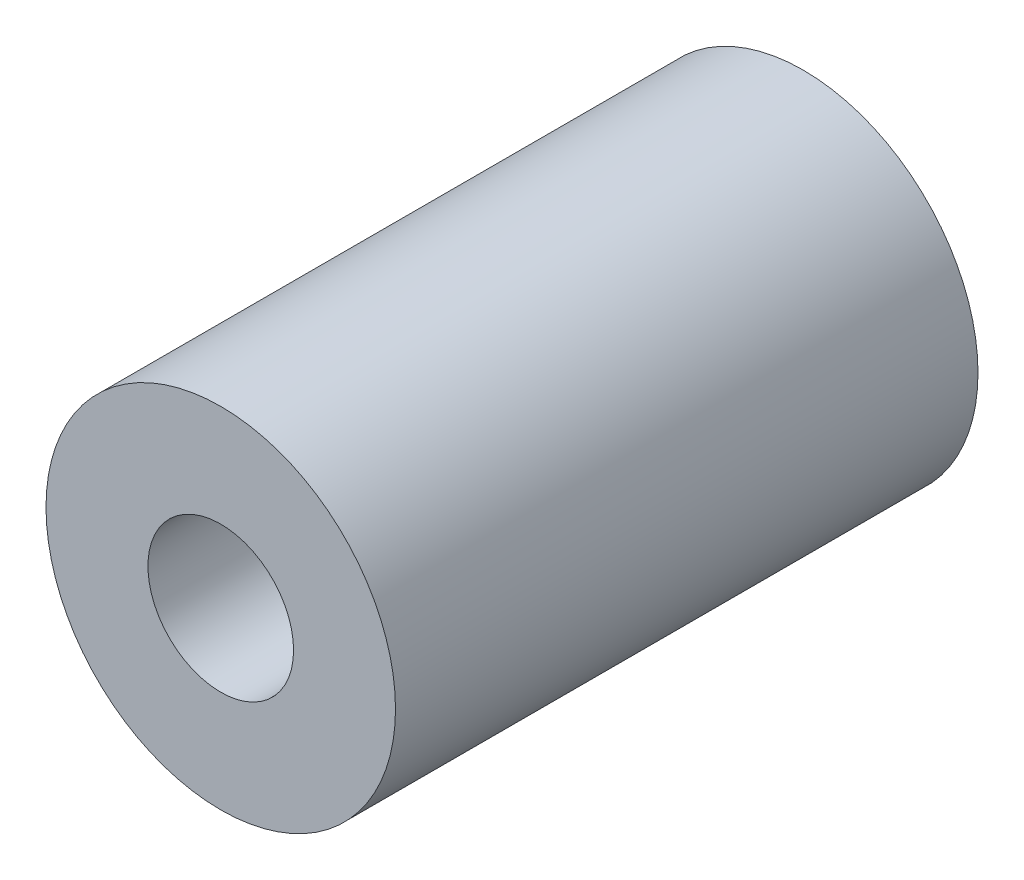
ISO-10303-21;
HEADER;
FILE_DESCRIPTION(('STEP AP214'),'2;1');
FILE_NAME('part.step','',(''),(''),'','','');
FILE_SCHEMA(('AUTOMOTIVE_DESIGN { 1 0 10303 214 1 1 1 1 }'));
ENDSEC;
DATA;
#1=APPLICATION_CONTEXT('core data for automotive mechanical design processes');
#2=APPLICATION_PROTOCOL_DEFINITION('international standard','automotive_design',2000,#1);
#3=PRODUCT_CONTEXT('',#1,'mechanical');
#4=PRODUCT('Part','Part','',(#3));
#5=PRODUCT_RELATED_PRODUCT_CATEGORY('part','',(#4));
#6=PRODUCT_DEFINITION_FORMATION('','',#4);
#7=PRODUCT_DEFINITION_CONTEXT('part definition',#1,'design');
#8=PRODUCT_DEFINITION('design','',#6,#7);
#9=PRODUCT_DEFINITION_SHAPE('','',#8);
#10=(LENGTH_UNIT() NAMED_UNIT(*) SI_UNIT(.MILLI.,.METRE.));
#11=(NAMED_UNIT(*) PLANE_ANGLE_UNIT() SI_UNIT($,.RADIAN.));
#12=(NAMED_UNIT(*) SI_UNIT($,.STERADIAN.) SOLID_ANGLE_UNIT());
#13=UNCERTAINTY_MEASURE_WITH_UNIT(LENGTH_MEASURE(1.E-05),#10,'distance_accuracy_value','');
#14=(GEOMETRIC_REPRESENTATION_CONTEXT(3) GLOBAL_UNCERTAINTY_ASSIGNED_CONTEXT((#13)) GLOBAL_UNIT_ASSIGNED_CONTEXT((#10,
#11,#12)) REPRESENTATION_CONTEXT('',''));
#15=CARTESIAN_POINT('',(0.,0.,0.));
#16=DIRECTION('',(0.,0.,1.));
#17=DIRECTION('',(1.,0.,0.));
#18=AXIS2_PLACEMENT_3D('',#15,#16,#17);
#19=CARTESIAN_POINT('',(0.,0.,20.));
#20=DIRECTION('',(0.,0.,1.));
#21=DIRECTION('',(1.,0.,0.));
#22=AXIS2_PLACEMENT_3D('',#19,#20,#21);
#23=PLANE('',#22);
#24=CARTESIAN_POINT('',(0.,0.,20.));
#25=DIRECTION('',(0.,0.,1.));
#26=DIRECTION('',(1.,0.,0.));
#27=AXIS2_PLACEMENT_3D('',#24,#25,#26);
#28=CIRCLE('',#27,6.);
#29=CARTESIAN_POINT('',(6.,0.,20.));
#30=VERTEX_POINT('',#29);
#31=EDGE_CURVE('E10',#30,#30,#28,.T.);
#32=ORIENTED_EDGE('',*,*,#31,.T.);
#33=EDGE_LOOP('',(#32));
#34=FACE_BOUND('',#33,.T.);
#35=CARTESIAN_POINT('',(0.,0.,20.));
#36=DIRECTION('',(0.,0.,1.));
#37=DIRECTION('',(1.,0.,0.));
#38=AXIS2_PLACEMENT_3D('',#35,#36,#37);
#39=CIRCLE('',#38,2.5);
#40=CARTESIAN_POINT('',(2.5,0.,20.));
#41=VERTEX_POINT('',#40);
#42=EDGE_CURVE('E49',#41,#41,#39,.T.);
#43=ORIENTED_EDGE('',*,*,#42,.F.);
#44=EDGE_LOOP('',(#43));
#45=FACE_BOUND('',#44,.T.);
#46=ADVANCED_FACE('F31',(#34,#45),#23,.T.);
#47=CARTESIAN_POINT('',(0.,0.,0.));
#48=DIRECTION('',(0.,0.,1.));
#49=DIRECTION('',(1.,0.,0.));
#50=AXIS2_PLACEMENT_3D('',#47,#48,#49);
#51=PLANE('',#50);
#52=CARTESIAN_POINT('',(0.,0.,0.));
#53=DIRECTION('',(0.,0.,1.));
#54=DIRECTION('',(1.,0.,0.));
#55=AXIS2_PLACEMENT_3D('',#52,#53,#54);
#56=CIRCLE('',#55,6.);
#57=CARTESIAN_POINT('',(6.,0.,0.));
#58=VERTEX_POINT('',#57);
#59=EDGE_CURVE('E44',#58,#58,#56,.T.);
#60=ORIENTED_EDGE('',*,*,#59,.F.);
#61=EDGE_LOOP('',(#60));
#62=FACE_BOUND('',#61,.T.);
#63=CARTESIAN_POINT('',(0.,0.,0.));
#64=DIRECTION('',(0.,0.,1.));
#65=DIRECTION('',(1.,0.,0.));
#66=AXIS2_PLACEMENT_3D('',#63,#64,#65);
#67=CIRCLE('',#66,2.5);
#68=CARTESIAN_POINT('',(2.5,0.,0.));
#69=VERTEX_POINT('',#68);
#70=EDGE_CURVE('E52',#69,#69,#67,.T.);
#71=ORIENTED_EDGE('',*,*,#70,.T.);
#72=EDGE_LOOP('',(#71));
#73=FACE_BOUND('',#72,.T.);
#74=ADVANCED_FACE('F84',(#62,#73),#51,.F.);
#75=CARTESIAN_POINT('',(0.,0.,20.));
#76=DIRECTION('',(0.,0.,-1.));
#77=DIRECTION('',(-1.,0.,0.));
#78=AXIS2_PLACEMENT_3D('',#75,#76,#77);
#79=CYLINDRICAL_SURFACE('',#78,6.);
#80=CARTESIAN_POINT('',(0.,-6.,16.3168562044865));
#81=CARTESIAN_POINT('',(0.0406867125193507,-5.99999944662232,16.3168544699261));
#82=CARTESIAN_POINT('',(0.0813990952861822,-5.99958177263351,16.3134300389247));
#83=CARTESIAN_POINT('',(0.161691669151217,-5.99795576178181,16.2998229758213));
#84=CARTESIAN_POINT('',(0.201270621329137,-5.99674659178938,16.2896332223721));
#85=CARTESIAN_POINT('',(0.278122256727522,-5.99367385407803,16.2627995407322));
#86=CARTESIAN_POINT('',(0.315396447082403,-5.9918107194395,16.2461598831558));
#87=CARTESIAN_POINT('',(0.386615967715561,-5.98763745519959,16.2069079051673));
#88=CARTESIAN_POINT('',(0.420561882601663,-5.98532740431124,16.1842966362484));
#89=CARTESIAN_POINT('',(0.484344661416893,-5.9805049605666,16.1336177731097));
#90=CARTESIAN_POINT('',(0.51416177217963,-5.97799168036421,16.1055254001488));
#91=CARTESIAN_POINT('',(0.568670476201841,-5.97305322473375,16.0447349293714));
#92=CARTESIAN_POINT('',(0.593361812422815,-5.97062805372906,16.0120366007214));
#93=CARTESIAN_POINT('',(0.636991112151046,-5.96613162791311,15.9428347389644));
#94=CARTESIAN_POINT('',(0.655910663780385,-5.96406151473546,15.906319517264));
#95=CARTESIAN_POINT('',(0.687341760107543,-5.96052120030255,15.8306008675067));
#96=CARTESIAN_POINT('',(0.699853533574907,-5.95905097763049,15.7913975354769));
#97=CARTESIAN_POINT('',(0.718054101513752,-5.95688532346395,15.7116200216804));
#98=CARTESIAN_POINT('',(0.723776166692863,-5.95618611507321,15.67105353465));
#99=CARTESIAN_POINT('',(0.728337823358177,-5.95563007572933,15.5895304853771));
#100=CARTESIAN_POINT('',(0.727177675605782,-5.95577321286043,15.5485739379725));
#101=CARTESIAN_POINT('',(0.718035167813165,-5.95688223604946,15.4676648219018));
#102=CARTESIAN_POINT('',(0.710089402908885,-5.95784370869435,15.4277080490092));
#103=CARTESIAN_POINT('',(0.687658283342413,-5.96047418470433,15.349699258168));
#104=CARTESIAN_POINT('',(0.673172803450605,-5.96214320161821,15.31164727671));
#105=CARTESIAN_POINT('',(0.638033933873038,-5.96600572794749,15.2384142196841));
#106=CARTESIAN_POINT('',(0.617364586292891,-5.96820059139065,15.2032408753998));
#107=CARTESIAN_POINT('',(0.570456132124663,-5.97286644393221,15.1368482335737));
#108=CARTESIAN_POINT('',(0.544216785974846,-5.97533744490493,15.1056291061923));
#109=CARTESIAN_POINT('',(0.486710099055614,-5.98029678197863,15.0478186439507));
#110=CARTESIAN_POINT('',(0.455411204893024,-5.98278512642109,15.0212586873149));
#111=CARTESIAN_POINT('',(0.388782677581777,-5.98748373812367,14.9737646383351));
#112=CARTESIAN_POINT('',(0.353453036061235,-5.9896940048062,14.9528305576764));
#113=CARTESIAN_POINT('',(0.279742102669006,-5.99358868047777,14.9171826923652));
#114=CARTESIAN_POINT('',(0.2413598815604,-5.99527292856663,14.9024708104915));
#115=CARTESIAN_POINT('',(0.162644945634727,-5.99792431403471,14.8797095501496));
#116=CARTESIAN_POINT('',(0.12231231671516,-5.99889148296409,14.8716598785546));
#117=CARTESIAN_POINT('',(0.041112841616446,-5.99999564404019,14.8624920647673));
#118=CARTESIAN_POINT('',(0.000250944757522722,-6.00013781452519,14.8613306852233));
#119=CARTESIAN_POINT('',(-0.0810851432364221,-5.99958992540127,14.8658584089032));
#120=CARTESIAN_POINT('',(-0.121559342106561,-5.99889988243118,14.871547375165));
#121=CARTESIAN_POINT('',(-0.20084400315693,-5.99676833953825,14.8895783898624));
#122=CARTESIAN_POINT('',(-0.239659207615562,-5.99532916167678,14.9018998837399));
#123=CARTESIAN_POINT('',(-0.314672264393776,-5.99186052646804,14.9328248628737));
#124=CARTESIAN_POINT('',(-0.350870032671799,-5.98983105017776,14.9514285497323));
#125=CARTESIAN_POINT('',(-0.419814194247367,-5.98539528867354,14.9944948686635));
#126=CARTESIAN_POINT('',(-0.452542954453183,-5.98298721968749,15.0189855424159));
#127=CARTESIAN_POINT('',(-0.513440801600527,-5.97806939685024,15.0730908751585));
#128=CARTESIAN_POINT('',(-0.541609718691035,-5.97555963921556,15.1027057249357));
#129=CARTESIAN_POINT('',(-0.592741130994908,-5.97070539169744,15.1664089177278));
#130=CARTESIAN_POINT('',(-0.615675011470036,-5.96836185623161,15.2005203116497));
#131=CARTESIAN_POINT('',(-0.655487821985608,-5.96412091361288,15.2721361371276));
#132=CARTESIAN_POINT('',(-0.672366867228649,-5.96222349797208,15.30964050411));
#133=CARTESIAN_POINT('',(-0.699544283426195,-5.95909605102472,15.3868843749764));
#134=CARTESIAN_POINT('',(-0.709858935257932,-5.95786436973076,15.4266180809692));
#135=CARTESIAN_POINT('',(-0.723667269174156,-5.95620305598766,15.5072693928005));
#136=CARTESIAN_POINT('',(-0.727161248079337,-5.95577338863667,15.5481869470418));
#137=CARTESIAN_POINT('',(-0.72722383085185,-5.95576572450737,15.629759830196));
#138=CARTESIAN_POINT('',(-0.723837387532693,-5.95618219950958,15.6704151314488));
#139=CARTESIAN_POINT('',(-0.710330291243021,-5.95780802509234,15.7505742696645));
#140=CARTESIAN_POINT('',(-0.700209636245643,-5.95901737591152,15.7900781062806));
#141=CARTESIAN_POINT('',(-0.673535195164139,-5.96209100959633,15.8668079407494));
#142=CARTESIAN_POINT('',(-0.656983437423161,-5.96395508594646,15.9040346525172));
#143=CARTESIAN_POINT('',(-0.617921073182439,-5.96812849116855,15.9751893829766));
#144=CARTESIAN_POINT('',(-0.595410409743558,-5.97043782429502,16.0091173701437));
#145=CARTESIAN_POINT('',(-0.544902046666125,-5.97525962308448,16.0729414928126));
#146=CARTESIAN_POINT('',(-0.516870830718767,-5.97777327151993,16.1028110168939));
#147=CARTESIAN_POINT('',(-0.456186618389702,-5.98270996285759,16.1574398208938));
#148=CARTESIAN_POINT('',(-0.423532531255691,-5.98513298420555,16.1821978913816));
#149=CARTESIAN_POINT('',(-0.35439610025209,-5.98962492787758,16.2259757724368));
#150=CARTESIAN_POINT('',(-0.317900461220229,-5.99169255059318,16.244974708717));
#151=CARTESIAN_POINT('',(-0.242232559024622,-5.99522744634168,16.2765475046649));
#152=CARTESIAN_POINT('',(-0.203063275982467,-5.99669537545826,16.2891283896524));
#153=CARTESIAN_POINT('',(-0.136406711588779,-5.99850912349959,16.3044754909499));
#154=CARTESIAN_POINT('',(-0.109340795991718,-5.9990654980085,16.3091116413199));
#155=CARTESIAN_POINT('',(-0.054853808588104,-5.99981112156948,16.3153025723981));
#156=CARTESIAN_POINT('',(-0.0274327391912447,-6.00000037311114,16.3168573740021));
#157=CARTESIAN_POINT('',(0.,-6.,16.3168562044865));
#158=B_SPLINE_CURVE_WITH_KNOTS('',3,(#80,#81,#82,#83,#84,#85,#86,#87,#88,#89,#90,#91,#92,#93,
#94,#95,#96,#97,#98,#99,#100,#101,#102,#103,#104,#105,#106,#107,#108,#109,#110,#111,#112,#113,
#114,#115,#116,#117,#118,#119,#120,#121,#122,#123,#124,#125,#126,#127,#128,#129,#130,#131,#132,
#133,#134,#135,#136,#137,#138,#139,#140,#141,#142,#143,#144,#145,#146,#147,#148,#149,#150,#151,
#152,#153,#154,#155,#156,#157),.UNSPECIFIED.,.T.,.F.,(4,2,2,2,2,2,2,2,2,2,2,2,2,2,2,2,2,2,2,2,2,
2,2,2,2,2,2,2,2,2,2,2,2,2,2,2,2,2,4),(0.,0.121959939359488,0.244048460764506,0.366056282550026,
0.488042635261983,0.610593800375944,0.733151109490645,0.856095381606163,0.979035264077471,
1.10137019946073,1.22370049970324,1.34537520354862,1.46705223745313,1.58904601611211,
1.7110450427015,1.8338365434332,1.9566282992082,2.07945757820077,2.20228145261273,
2.32433354690492,2.44638320099369,2.5680567761338,2.68973425627851,2.81200323078599,
2.9342767586812,3.05720343129288,3.18012776491056,3.30274602355956,3.42535894601249,
3.54717336076342,3.66898781217808,3.79076387496567,3.9125411014022,4.03508181375553,
4.15765148755217,4.2806602510096,4.40353407627483,4.48576529353596,4.56799595315579),.UNSPECIFIED.);
#159=CARTESIAN_POINT('',(0.,-6.,16.3168562044865));
#160=VERTEX_POINT('',#159);
#161=EDGE_CURVE('E60',#160,#160,#158,.T.);
#162=ORIENTED_EDGE('',*,*,#161,.T.);
#163=EDGE_LOOP('',(#162));
#164=FACE_BOUND('',#163,.T.);
#165=CARTESIAN_POINT('',(0.,-6.,4.99014675090497));
#166=CARTESIAN_POINT('',(0.048450258849126,-5.99999924350012,4.99014473764678));
#167=CARTESIAN_POINT('',(0.0969291357230117,-5.9994069816752,4.98607354135146));
#168=CARTESIAN_POINT('',(0.192533240462012,-5.99710132470148,4.96989964501937));
#169=CARTESIAN_POINT('',(0.23965707983713,-5.99538681954419,4.95778899300582));
#170=CARTESIAN_POINT('',(0.331153576736141,-5.99102945867061,4.92590442775588));
#171=CARTESIAN_POINT('',(0.375528233231743,-5.98838728702018,4.90613616017649));
#172=CARTESIAN_POINT('',(0.460323305897501,-5.98246699343266,4.85951098770333));
#173=CARTESIAN_POINT('',(0.500744299861464,-5.97918896463014,4.83265512072914));
#174=CARTESIAN_POINT('',(0.576785962946577,-5.97233514841792,4.77240870312094));
#175=CARTESIAN_POINT('',(0.612373693628641,-5.96875756270683,4.73897677855763));
#176=CARTESIAN_POINT('',(0.677454550087917,-5.96172202128414,4.66661626065399));
#177=CARTESIAN_POINT('',(0.70694733506232,-5.95826407227111,4.62768736015146));
#178=CARTESIAN_POINT('',(0.759128114916702,-5.95184183879846,4.54521822048252));
#179=CARTESIAN_POINT('',(0.781784464300672,-5.94887987753001,4.50165776164451));
#180=CARTESIAN_POINT('',(0.819447044533628,-5.94380937503717,4.41129993738719));
#181=CARTESIAN_POINT('',(0.834453662465473,-5.9417007906323,4.36450273588591));
#182=CARTESIAN_POINT('',(0.856288983346832,-5.93859336793183,4.26934529293682));
#183=CARTESIAN_POINT('',(0.863173915333762,-5.93758690283622,4.22099820765396));
#184=CARTESIAN_POINT('',(0.868744572849261,-5.93677448445624,4.12382524094512));
#185=CARTESIAN_POINT('',(0.867430736144494,-5.93696846707494,4.0749993852217));
#186=CARTESIAN_POINT('',(0.856687149720778,-5.9385280502203,3.97865082175739));
#187=CARTESIAN_POINT('',(0.847319864107626,-5.93988463313738,3.93112098187375));
#188=CARTESIAN_POINT('',(0.820832989135106,-5.94360248394793,3.83831486635309));
#189=CARTESIAN_POINT('',(0.803713194804277,-5.94596377840524,3.79303865033561));
#190=CARTESIAN_POINT('',(0.762141801365647,-5.95143501799188,3.70583402816175));
#191=CARTESIAN_POINT('',(0.737663585228288,-5.9545476727649,3.66391848759472));
#192=CARTESIAN_POINT('',(0.682089169853974,-5.96116892825575,3.58476620779719));
#193=CARTESIAN_POINT('',(0.650992566765766,-5.96467755312938,3.54752975430328));
#194=CARTESIAN_POINT('',(0.582720451790954,-5.97173531829104,3.47843050732993));
#195=CARTESIAN_POINT('',(0.545491202953448,-5.97528453239303,3.44662079109912));
#196=CARTESIAN_POINT('',(0.466194180742665,-5.98199328010755,3.38969303262783));
#197=CARTESIAN_POINT('',(0.424126388818465,-5.98515281222594,3.36457501604447));
#198=CARTESIAN_POINT('',(0.336301604857017,-5.99072917051398,3.32174156474518));
#199=CARTESIAN_POINT('',(0.290542676691984,-5.99314560366267,3.30403004550926));
#200=CARTESIAN_POINT('',(0.196657299272614,-5.99696015833999,3.27655756133619));
#201=CARTESIAN_POINT('',(0.148530998782379,-5.99835834376759,3.26679609749791));
#202=CARTESIAN_POINT('',(0.0517352926940474,-5.99997044005836,3.2555709786813));
#203=CARTESIAN_POINT('',(0.00307452017378454,-6.00019476974051,3.25403431980577));
#204=CARTESIAN_POINT('',(-0.0938100691451757,-5.99946218619619,3.25910891562481));
#205=CARTESIAN_POINT('',(-0.142033898441591,-5.9985053068635,3.26571993652865));
#206=CARTESIAN_POINT('',(-0.236455902390164,-5.99552427045123,3.28684153356627));
#207=CARTESIAN_POINT('',(-0.282662157771273,-5.99350489621256,3.30131671845122));
#208=CARTESIAN_POINT('',(-0.371991785177521,-5.98862463970915,3.33771854716665));
#209=CARTESIAN_POINT('',(-0.415115021338285,-5.98576372038708,3.35964551914236));
#210=CARTESIAN_POINT('',(-0.497376689987132,-5.97949260723523,3.41050100976448));
#211=CARTESIAN_POINT('',(-0.536486082318067,-5.97607881626972,3.43947605092278));
#212=CARTESIAN_POINT('',(-0.609313046336447,-5.96909361271163,3.50354017307396));
#213=CARTESIAN_POINT('',(-0.643030327897755,-5.96552219165085,3.53862958284243));
#214=CARTESIAN_POINT('',(-0.704380067085329,-5.95859141583268,3.61425060997502));
#215=CARTESIAN_POINT('',(-0.731963710378008,-5.95523390420246,3.65482202374731));
#216=CARTESIAN_POINT('',(-0.779924356634162,-5.94914320992011,3.74006513774995));
#217=CARTESIAN_POINT('',(-0.800301543220615,-5.94641001136091,3.78473673346972));
#218=CARTESIAN_POINT('',(-0.833194395553277,-5.94189058242268,3.87676382087629));
#219=CARTESIAN_POINT('',(-0.845736174139041,-5.94010120972108,3.92410981808854));
#220=CARTESIAN_POINT('',(-0.862685552642442,-5.93766352985695,4.02026379672002));
#221=CARTESIAN_POINT('',(-0.867093670984173,-5.93701514996982,4.06907168475957));
#222=CARTESIAN_POINT('',(-0.867638918657975,-5.93693544985482,4.16627765614908));
#223=CARTESIAN_POINT('',(-0.863852781960014,-5.93749283835204,4.21467531739961));
#224=CARTESIAN_POINT('',(-0.848280979067022,-5.93973739384762,4.31013807936587));
#225=CARTESIAN_POINT('',(-0.836495322156055,-5.94142455953478,4.35720318162806));
#226=CARTESIAN_POINT('',(-0.805285453321963,-5.94573472634392,4.44864612962134));
#227=CARTESIAN_POINT('',(-0.785866222030187,-5.94835711716203,4.49302570581791));
#228=CARTESIAN_POINT('',(-0.739948035374756,-5.95424305486092,4.57790920990993));
#229=CARTESIAN_POINT('',(-0.713448874876036,-5.95750662031848,4.61841302546224));
#230=CARTESIAN_POINT('',(-0.653842823338387,-5.96434363198559,4.69478571985681));
#231=CARTESIAN_POINT('',(-0.620679001282804,-5.96791958670135,4.73060994628426));
#232=CARTESIAN_POINT('',(-0.548805221915663,-5.97495722964538,4.79621239718724));
#233=CARTESIAN_POINT('',(-0.510093973612248,-5.97841889104404,4.82598921040448));
#234=CARTESIAN_POINT('',(-0.427993196942461,-5.98485793806584,4.87878591465264));
#235=CARTESIAN_POINT('',(-0.384580837750961,-5.98783276645534,4.90177060636191));
#236=CARTESIAN_POINT('',(-0.294490274290116,-5.99293776146893,4.94008847557075));
#237=CARTESIAN_POINT('',(-0.247815550172446,-5.99506881249538,4.95542966895893));
#238=CARTESIAN_POINT('',(-0.167436368612411,-5.99775329917388,4.97449972264466));
#239=CARTESIAN_POINT('',(-0.134230751591083,-5.998591537338,4.98035851736251));
#240=CARTESIAN_POINT('',(-0.0673546971030406,-5.99971514764526,4.98818270965953));
#241=CARTESIAN_POINT('',(-0.0336842648161541,-6.0000005259444,4.99014815059041));
#242=CARTESIAN_POINT('',(0.,-6.,4.99014675090497));
#243=B_SPLINE_CURVE_WITH_KNOTS('',3,(#165,#166,#167,#168,#169,#170,#171,#172,#173,#174,#175,
#176,#177,#178,#179,#180,#181,#182,#183,#184,#185,#186,#187,#188,#189,#190,#191,#192,#193,#194,
#195,#196,#197,#198,#199,#200,#201,#202,#203,#204,#205,#206,#207,#208,#209,#210,#211,#212,#213,
#214,#215,#216,#217,#218,#219,#220,#221,#222,#223,#224,#225,#226,#227,#228,#229,#230,#231,#232,
#233,#234,#235,#236,#237,#238,#239,#240,#241,#242),.UNSPECIFIED.,.T.,.F.,(4,2,2,2,2,2,2,2,2,2,2,
2,2,2,2,2,2,2,2,2,2,2,2,2,2,2,2,2,2,2,2,2,2,2,2,2,2,2,4),(0.,0.145227702078011,
0.290599266069581,0.435863856718877,0.581107186378048,0.727295375998204,0.873491737614642,
1.02035480407648,1.16721043840548,1.31304326288168,1.45886830079809,1.60357239154364,
1.74828030839784,1.89351809626752,2.03876474902952,2.18535936113716,2.33195453530567,
2.47862711003496,2.62529047970216,2.77064987038288,2.91600509019675,3.06071151929183,
3.2054243214725,3.35111957103343,3.49682265718943,3.64364682072711,3.79046724286538,
3.93679571343065,4.08311485697421,4.22806974768073,4.37302447015612,4.51788477147933,
4.66274927046467,4.80890828687988,4.95510137268976,5.10203930867045,5.24882282184599,
5.3497911750133,5.45075840391233),.UNSPECIFIED.);
#244=CARTESIAN_POINT('',(0.,-6.,4.99014675090497));
#245=VERTEX_POINT('',#244);
#246=EDGE_CURVE('E59',#245,#245,#243,.T.);
#247=ORIENTED_EDGE('',*,*,#246,.T.);
#248=EDGE_LOOP('',(#247));
#249=FACE_BOUND('',#248,.T.);
#250=ORIENTED_EDGE('',*,*,#31,.F.);
#251=EDGE_LOOP('',(#250));
#252=FACE_BOUND('',#251,.T.);
#253=ORIENTED_EDGE('',*,*,#59,.T.);
#254=EDGE_LOOP('',(#253));
#255=FACE_BOUND('',#254,.T.);
#256=ADVANCED_FACE('F33',(#164,#249,#252,#255),#79,.T.);
#257=CARTESIAN_POINT('',(0.,0.,20.));
#258=DIRECTION('',(0.,0.,-1.));
#259=DIRECTION('',(-1.,0.,0.));
#260=AXIS2_PLACEMENT_3D('',#257,#258,#259);
#261=CYLINDRICAL_SURFACE('',#260,2.5);
#262=CARTESIAN_POINT('',(0.,-2.5,16.3168562044865));
#263=CARTESIAN_POINT('',(0.0399485275370964,-2.49999956877279,16.3168555754422));
#264=CARTESIAN_POINT('',(0.0799034687893797,-2.49903323714302,16.313553376843));
#265=CARTESIAN_POINT('',(0.158653355285545,-2.49527258482162,16.300460896442));
#266=CARTESIAN_POINT('',(0.197447889883532,-2.49247762483241,16.2906683455651));
#267=CARTESIAN_POINT('',(0.272729511893312,-2.4853666084226,16.2649472063509));
#268=CARTESIAN_POINT('',(0.309219797871734,-2.48105271774563,16.249027351541));
#269=CARTESIAN_POINT('',(0.379012996865521,-2.47135433547065,16.2115383624986));
#270=CARTESIAN_POINT('',(0.412315542995231,-2.46596972085906,16.1899685790653));
#271=CARTESIAN_POINT('',(0.475692287546827,-2.45454272737614,16.1411744318694));
#272=CARTESIAN_POINT('',(0.505667656281405,-2.44848748605985,16.1138247192257));
#273=CARTESIAN_POINT('',(0.560677569850879,-2.43648005317429,16.054514442704));
#274=CARTESIAN_POINT('',(0.585711342354804,-2.4305278778458,16.0225531594244));
#275=CARTESIAN_POINT('',(0.630636518134026,-2.41926574486805,15.9541043180425));
#276=CARTESIAN_POINT('',(0.65040927636298,-2.41397184330702,15.9175360009709));
#277=CARTESIAN_POINT('',(0.683484984489536,-2.40481701933284,15.8414146226604));
#278=CARTESIAN_POINT('',(0.696789383423298,-2.40095577602281,15.8018622322065));
#279=CARTESIAN_POINT('',(0.716198059641844,-2.39523714178173,15.7220011131021));
#280=CARTESIAN_POINT('',(0.722483707611101,-2.39332938512053,15.681740163769));
#281=CARTESIAN_POINT('',(0.728242576891441,-2.39158370282976,15.6006934706916));
#282=CARTESIAN_POINT('',(0.727717338472967,-2.39174530921713,15.5599078476855));
#283=CARTESIAN_POINT('',(0.720012234807125,-2.39407533048213,15.4804271427288));
#284=CARTESIAN_POINT('',(0.713057322417246,-2.39617590359876,15.4417079387685));
#285=CARTESIAN_POINT('',(0.693052844697489,-2.40203774329639,15.3660114540866));
#286=CARTESIAN_POINT('',(0.680002710410381,-2.40579916490716,15.3290343363345));
#287=CARTESIAN_POINT('',(0.648007620070295,-2.4146145692937,15.2573112317784));
#288=CARTESIAN_POINT('',(0.628988046312865,-2.41968476065074,15.2226006083313));
#289=CARTESIAN_POINT('',(0.585645878914737,-2.43053837106497,15.1567872057152));
#290=CARTESIAN_POINT('',(0.561322067060462,-2.43632195383256,15.1256852578614));
#291=CARTESIAN_POINT('',(0.506935261150796,-2.44822790179098,15.0666934112001));
#292=CARTESIAN_POINT('',(0.476684929399155,-2.45435466775555,15.0389768322399));
#293=CARTESIAN_POINT('',(0.411889515324607,-2.46605542248692,14.988971020529));
#294=CARTESIAN_POINT('',(0.377344194146818,-2.47162938047971,14.9666820898272));
#295=CARTESIAN_POINT('',(0.304637747058182,-2.4816423320217,14.9280674506553));
#296=CARTESIAN_POINT('',(0.266456251241892,-2.4860743456291,14.9117781657584));
#297=CARTESIAN_POINT('',(0.187737226556351,-2.49325375024795,14.8859023858985));
#298=CARTESIAN_POINT('',(0.14720031702117,-2.49600158192448,14.8763141375217));
#299=CARTESIAN_POINT('',(0.0663961960804041,-2.49943418010405,14.8643964603572));
#300=CARTESIAN_POINT('',(0.0261664440154528,-2.50018573931275,14.861831932015));
#301=CARTESIAN_POINT('',(-0.0541502251871506,-2.4997359508876,14.8633783001147));
#302=CARTESIAN_POINT('',(-0.0942371595201672,-2.49853484690813,14.8674883636973));
#303=CARTESIAN_POINT('',(-0.172256651858944,-2.49435826893118,14.8820762847212));
#304=CARTESIAN_POINT('',(-0.210216777991474,-2.4914206040905,14.8924185425156));
#305=CARTESIAN_POINT('',(-0.28385625041788,-2.48410869871748,14.9190157506576));
#306=CARTESIAN_POINT('',(-0.319535328400313,-2.47973428955616,14.9352713950765));
#307=CARTESIAN_POINT('',(-0.38847881910082,-2.46988353415261,14.9736402083093));
#308=CARTESIAN_POINT('',(-0.421672073883024,-2.46438488798977,14.9958753620034));
#309=CARTESIAN_POINT('',(-0.483937063607036,-2.45291844727955,15.0454223910532));
#310=CARTESIAN_POINT('',(-0.513007823822286,-2.44695054229695,15.0727354635205));
#311=CARTESIAN_POINT('',(-0.567225548847045,-2.43496473843626,15.1327660712826));
#312=CARTESIAN_POINT('',(-0.592205554923944,-2.42895203528065,15.1656357506669));
#313=CARTESIAN_POINT('',(-0.636304600971592,-2.41777498377282,15.2352305520811));
#314=CARTESIAN_POINT('',(-0.655423828860259,-2.41261060822258,15.2719555504447));
#315=CARTESIAN_POINT('',(-0.687121764652648,-2.40377510289963,15.3480776903642));
#316=CARTESIAN_POINT('',(-0.69973380994255,-2.40009638338126,15.3874600189921));
#317=CARTESIAN_POINT('',(-0.718114251502746,-2.39466188821081,15.4679150363672));
#318=CARTESIAN_POINT('',(-0.723884816734353,-2.39290550313269,15.5089871851138));
#319=CARTESIAN_POINT('',(-0.728277195698312,-2.39157205839606,15.589928950781));
#320=CARTESIAN_POINT('',(-0.727170021619013,-2.3919123753075,15.629782699654));
#321=CARTESIAN_POINT('',(-0.718480073705325,-2.39453681063581,15.7087093042169));
#322=CARTESIAN_POINT('',(-0.710897530926376,-2.39682085969602,15.7477821877189));
#323=CARTESIAN_POINT('',(-0.689642225631427,-2.40302168362612,15.8236240397543));
#324=CARTESIAN_POINT('',(-0.676037142927065,-2.40692028403071,15.8604135703658));
#325=CARTESIAN_POINT('',(-0.643175389728444,-2.41590858442724,15.9312170455397));
#326=CARTESIAN_POINT('',(-0.623917689132863,-2.42099850148374,15.9652304827572));
#327=CARTESIAN_POINT('',(-0.579519157860232,-2.43201502163928,16.0307842507352));
#328=CARTESIAN_POINT('',(-0.554198377733083,-2.43796442178534,16.0621988775263));
#329=CARTESIAN_POINT('',(-0.498721529850448,-2.44991442977529,16.1204211292709));
#330=CARTESIAN_POINT('',(-0.468564232947214,-2.45591505026828,16.1472275795091));
#331=CARTESIAN_POINT('',(-0.403292373179374,-2.46748486724457,16.1961888951341));
#332=CARTESIAN_POINT('',(-0.36806625095407,-2.47303810929408,16.2181991787676));
#333=CARTESIAN_POINT('',(-0.29425195494348,-2.48290121629744,16.2559527552267));
#334=CARTESIAN_POINT('',(-0.255665537948067,-2.48721172594089,16.271699299095));
#335=CARTESIAN_POINT('',(-0.1811314085166,-2.49367494806438,16.2948808605903));
#336=CARTESIAN_POINT('',(-0.145443318217668,-2.49602792133136,16.3031002311096));
#337=CARTESIAN_POINT('',(-0.0731718582492041,-2.49919053283481,16.3140877957325));
#338=CARTESIAN_POINT('',(-0.0365886192353726,-2.50000039495844,16.3168567806245));
#339=CARTESIAN_POINT('',(0.,-2.5,16.3168562044865));
#340=B_SPLINE_CURVE_WITH_KNOTS('',3,(#262,#263,#264,#265,#266,#267,#268,#269,#270,#271,#272,
#273,#274,#275,#276,#277,#278,#279,#280,#281,#282,#283,#284,#285,#286,#287,#288,#289,#290,#291,
#292,#293,#294,#295,#296,#297,#298,#299,#300,#301,#302,#303,#304,#305,#306,#307,#308,#309,#310,
#311,#312,#313,#314,#315,#316,#317,#318,#319,#320,#321,#322,#323,#324,#325,#326,#327,#328,#329,
#330,#331,#332,#333,#334,#335,#336,#337,#338,#339),.UNSPECIFIED.,.T.,.F.,(4,2,2,2,2,2,2,2,2,2,2,
2,2,2,2,2,2,2,2,2,2,2,2,2,2,2,2,2,2,2,2,2,2,2,2,2,2,2,4),(0.,0.119711247260316,
0.239464368547921,0.359047428580707,0.478644235246331,0.601164894259979,0.723704687112832,
0.848810204638345,0.973887683207406,1.09565233257806,1.21738944555939,1.33502228139924,
1.45266609984704,1.57184332217021,1.69104794456515,1.81491726353307,1.93879347426112,
2.06340979745774,2.18799350094255,2.30835297833522,2.4286974383586,2.54651349746305,
2.66434338944353,2.78478817059304,2.90526138250853,3.02982953797278,3.15439369890987,
3.27831319671252,3.40219339767764,3.52122399875946,3.6402503527443,3.75797179404686,
3.8757147015765,3.99751723037497,4.11935076314737,4.24446275162029,4.36950971874783,
4.47916845089896,4.58881127165454),.UNSPECIFIED.);
#341=CARTESIAN_POINT('',(0.,-2.5,16.3168562044865));
#342=VERTEX_POINT('',#341);
#343=EDGE_CURVE('E36',#342,#342,#340,.T.);
#344=ORIENTED_EDGE('',*,*,#343,.F.);
#345=EDGE_LOOP('',(#344));
#346=FACE_BOUND('',#345,.T.);
#347=CARTESIAN_POINT('',(0.,-2.5,4.99014675090497));
#348=CARTESIAN_POINT('',(0.0472157914149362,-2.50000043811706,4.99014738340475));
#349=CARTESIAN_POINT('',(0.0944270812355602,-2.49865027904824,4.98627906632878));
#350=CARTESIAN_POINT('',(0.187452458240685,-2.49339779017449,4.97096010352355));
#351=CARTESIAN_POINT('',(0.233266513738352,-2.48949540253445,4.95950928596997));
#352=CARTESIAN_POINT('',(0.322142902832705,-2.47956088393023,4.92946970660111));
#353=CARTESIAN_POINT('',(0.365209910238027,-2.47353249081066,4.91089346738085));
#354=CARTESIAN_POINT('',(0.447616191638608,-2.45995651083719,4.86718920533988));
#355=CARTESIAN_POINT('',(0.486954635575946,-2.45240858686613,4.84205972827753));
#356=CARTESIAN_POINT('',(0.562248519715378,-2.43626960192613,4.78498349952348));
#357=CARTESIAN_POINT('',(0.598046542622668,-2.42765207196442,4.75283662263683));
#358=CARTESIAN_POINT('',(0.663865742155511,-2.41048572957464,4.683063322067));
#359=CARTESIAN_POINT('',(0.693885500343364,-2.40193693451174,4.64543555691775));
#360=CARTESIAN_POINT('',(0.748226267546212,-2.38557959952048,4.5643136178026));
#361=CARTESIAN_POINT('',(0.772337104330703,-2.37780300756502,4.52067158599507));
#362=CARTESIAN_POINT('',(0.812808550297995,-2.36427599375289,4.4296388158293));
#363=CARTESIAN_POINT('',(0.829171751348141,-2.35852489446006,4.38224933732915));
#364=CARTESIAN_POINT('',(0.853083037120071,-2.3499800616596,4.28686496603815));
#365=CARTESIAN_POINT('',(0.860927949357775,-2.34708708661265,4.23895364837982));
#366=CARTESIAN_POINT('',(0.868508092246081,-2.34429341137702,4.14241411341943));
#367=CARTESIAN_POINT('',(0.868246081594466,-2.34439169329591,4.09378614561569));
#368=CARTESIAN_POINT('',(0.859849158032667,-2.34748289551104,3.99978061814262));
#369=CARTESIAN_POINT('',(0.852108928790173,-2.35033069716196,3.9543621863875));
#370=CARTESIAN_POINT('',(0.829621857240701,-2.35836143211725,3.86551389704169));
#371=CARTESIAN_POINT('',(0.814874109964252,-2.3635446670212,3.82208429708847));
#372=CARTESIAN_POINT('',(0.778545761233674,-2.37576046620203,3.7375791932562));
#373=CARTESIAN_POINT('',(0.756852899177257,-2.38282306735482,3.69655648067782));
#374=CARTESIAN_POINT('',(0.707328083244845,-2.39799004862811,3.61861195333316));
#375=CARTESIAN_POINT('',(0.679494240498053,-2.40609474896153,3.58169140559451));
#376=CARTESIAN_POINT('',(0.616610323624189,-2.42299584393576,3.51079138881874));
#377=CARTESIAN_POINT('',(0.581239895035618,-2.43180536374465,3.4770985652322));
#378=CARTESIAN_POINT('',(0.50524410011443,-2.44872253064184,3.41604458206402));
#379=CARTESIAN_POINT('',(0.464618142943498,-2.45683009864382,3.38868413534843));
#380=CARTESIAN_POINT('',(0.378618051675388,-2.47155228379358,3.34081475518102));
#381=CARTESIAN_POINT('',(0.333194569932249,-2.47814860850146,3.32038846095997));
#382=CARTESIAN_POINT('',(0.239271714384283,-2.48897151861507,3.28755813543154));
#383=CARTESIAN_POINT('',(0.190773509807455,-2.49319899887816,3.27515107449733));
#384=CARTESIAN_POINT('',(0.0945001206385494,-2.49865678335501,3.25923276199998));
#385=CARTESIAN_POINT('',(0.046796211325024,-2.50001733633008,3.25533462019984));
#386=CARTESIAN_POINT('',(-0.0485972659245134,-2.49998233934111,3.25543499482771));
#387=CARTESIAN_POINT('',(-0.0962868348812345,-2.49858729902559,3.25943205103441));
#388=CARTESIAN_POINT('',(-0.188710721472637,-2.49328393894488,3.27490669819592));
#389=CARTESIAN_POINT('',(-0.233490784659136,-2.48945713927117,3.28614181003408));
#390=CARTESIAN_POINT('',(-0.320508334139555,-2.47975657891795,3.31546543888516));
#391=CARTESIAN_POINT('',(-0.362745491270292,-2.47388255390325,3.33355484094183));
#392=CARTESIAN_POINT('',(-0.444772082748657,-2.46047826687592,3.37662040101243));
#393=CARTESIAN_POINT('',(-0.484462564505139,-2.45290698493846,3.40177189190757));
#394=CARTESIAN_POINT('',(-0.559182510299703,-2.43696059603999,3.45804437246994));
#395=CARTESIAN_POINT('',(-0.59421044266693,-2.42858522647976,3.4891673156322));
#396=CARTESIAN_POINT('',(-0.660415588537134,-2.41144745568213,3.5583156081019));
#397=CARTESIAN_POINT('',(-0.691316941631079,-2.40268638328469,3.59660606575142));
#398=CARTESIAN_POINT('',(-0.746296099253424,-2.38618287206758,3.67801340897062));
#399=CARTESIAN_POINT('',(-0.770373701431953,-2.37844046345877,3.7211304376134));
#400=CARTESIAN_POINT('',(-0.810945332095267,-2.36491595495514,3.81107692780621));
#401=CARTESIAN_POINT('',(-0.827442350845763,-2.35913308233109,3.85790491695546));
#402=CARTESIAN_POINT('',(-0.852231302045683,-2.35029325585841,3.9539246124733));
#403=CARTESIAN_POINT('',(-0.860527346925996,-2.34723493584151,4.00311512115131));
#404=CARTESIAN_POINT('',(-0.868342234706959,-2.34435435952503,4.09952403535424));
#405=CARTESIAN_POINT('',(-0.868322798824151,-2.34436187031506,4.14670031118887));
#406=CARTESIAN_POINT('',(-0.86065840232959,-2.34718627760608,4.2403391826816));
#407=CARTESIAN_POINT('',(-0.85301397121569,-2.35000297903018,4.28680182766842));
#408=CARTESIAN_POINT('',(-0.830654509544027,-2.35799666393448,4.37665520827909));
#409=CARTESIAN_POINT('',(-0.816101100083878,-2.36311956369535,4.42009136164364));
#410=CARTESIAN_POINT('',(-0.780470962053653,-2.37512458902463,4.50393679855973));
#411=CARTESIAN_POINT('',(-0.759392713647015,-2.38200712440144,4.54434537416831));
#412=CARTESIAN_POINT('',(-0.710167804908048,-2.39715525785118,4.62303004500662));
#413=CARTESIAN_POINT('',(-0.681737702470948,-2.40547033563506,4.66111921710694));
#414=CARTESIAN_POINT('',(-0.619082247338476,-2.4223518915614,4.73213487217173));
#415=CARTESIAN_POINT('',(-0.584855192186563,-2.4309184429442,4.765059833017));
#416=CARTESIAN_POINT('',(-0.50979019429829,-2.44778568157686,4.82626331544504));
#417=CARTESIAN_POINT('',(-0.468729277377103,-2.45605854724135,4.85427706977781));
#418=CARTESIAN_POINT('',(-0.382201916561435,-2.47100103271372,4.90298042687073));
#419=CARTESIAN_POINT('',(-0.336736160989074,-2.4776709024486,4.92367117161722));
#420=CARTESIAN_POINT('',(-0.243471878581138,-2.48855093669563,4.95671771534857));
#421=CARTESIAN_POINT('',(-0.195726800593353,-2.49280136311493,4.96921050880675));
#422=CARTESIAN_POINT('',(-0.0986524844690404,-2.49852519793676,4.98592330204916));
#423=CARTESIAN_POINT('',(-0.0493237859729145,-2.49999954232278,4.99014609016663));
#424=CARTESIAN_POINT('',(0.,-2.5,4.99014675090497));
#425=B_SPLINE_CURVE_WITH_KNOTS('',3,(#347,#348,#349,#350,#351,#352,#353,#354,#355,#356,#357,
#358,#359,#360,#361,#362,#363,#364,#365,#366,#367,#368,#369,#370,#371,#372,#373,#374,#375,#376,
#377,#378,#379,#380,#381,#382,#383,#384,#385,#386,#387,#388,#389,#390,#391,#392,#393,#394,#395,
#396,#397,#398,#399,#400,#401,#402,#403,#404,#405,#406,#407,#408,#409,#410,#411,#412,#413,#414,
#415,#416,#417,#418,#419,#420,#421,#422,#423,#424),.UNSPECIFIED.,.T.,.F.,(4,2,2,2,2,2,2,2,2,2,2,
2,2,2,2,2,2,2,2,2,2,2,2,2,2,2,2,2,2,2,2,2,2,2,2,2,2,2,4),(0.,0.141465726442917,
0.282934658699487,0.424156096706479,0.56540890014203,0.711392243154496,0.857411376312026,
1.00804692897054,1.15863205286307,1.3037825035689,1.44888356169668,1.5867225217832,
1.72457928759883,1.8647875489373,2.00503899644331,2.15326611132211,2.30150990473105,
2.45146302754268,2.60135946563866,2.74428451372629,2.8871831302211,3.02552729667918,
3.16388933258606,3.30604757152925,3.44825239551795,3.59748513530608,3.74672229994309,
3.89590054527949,4.04500394622439,4.18582944377305,4.32664516274412,4.4643179319212,
4.60202279350063,4.74614002904441,4.89029966274769,5.04073685868664,5.19115058435785,
5.33898203639889,5.48676363667439),.UNSPECIFIED.);
#426=CARTESIAN_POINT('',(0.,-2.5,4.99014675090497));
#427=VERTEX_POINT('',#426);
#428=EDGE_CURVE('E54',#427,#427,#425,.T.);
#429=ORIENTED_EDGE('',*,*,#428,.F.);
#430=EDGE_LOOP('',(#429));
#431=FACE_BOUND('',#430,.T.);
#432=ORIENTED_EDGE('',*,*,#42,.T.);
#433=EDGE_LOOP('',(#432));
#434=FACE_BOUND('',#433,.T.);
#435=ORIENTED_EDGE('',*,*,#70,.F.);
#436=EDGE_LOOP('',(#435));
#437=FACE_BOUND('',#436,.T.);
#438=ADVANCED_FACE('F61',(#346,#431,#434,#437),#261,.F.);
#439=CARTESIAN_POINT('',(0.,-6.,4.12276554549957));
#440=DIRECTION('',(0.,1.,0.));
#441=DIRECTION('',(0.,0.,1.));
#442=AXIS2_PLACEMENT_3D('',#439,#440,#441);
#443=CYLINDRICAL_SURFACE('',#442,0.867381205405398);
#444=ORIENTED_EDGE('',*,*,#428,.T.);
#445=EDGE_LOOP('',(#444));
#446=FACE_BOUND('',#445,.T.);
#447=ORIENTED_EDGE('',*,*,#246,.F.);
#448=EDGE_LOOP('',(#447));
#449=FACE_BOUND('',#448,.T.);
#450=ADVANCED_FACE('F64',(#446,#449),#443,.F.);
#451=CARTESIAN_POINT('',(0.,-6.,15.5896633496931));
#452=DIRECTION('',(0.,1.,0.));
#453=DIRECTION('',(0.,0.,1.));
#454=AXIS2_PLACEMENT_3D('',#451,#452,#453);
#455=CYLINDRICAL_SURFACE('',#454,0.727192854793473);
#456=ORIENTED_EDGE('',*,*,#343,.T.);
#457=EDGE_LOOP('',(#456));
#458=FACE_BOUND('',#457,.T.);
#459=ORIENTED_EDGE('',*,*,#161,.F.);
#460=EDGE_LOOP('',(#459));
#461=FACE_BOUND('',#460,.T.);
#462=ADVANCED_FACE('F67',(#458,#461),#455,.F.);
#463=CLOSED_SHELL('',(#46,#74,#256,#438,#450,#462));
#464=MANIFOLD_SOLID_BREP('B2',#463);
#465=ADVANCED_BREP_SHAPE_REPRESENTATION('',(#18,#464),#14);
#466=SHAPE_DEFINITION_REPRESENTATION(#9,#465);
ENDSEC;
END-ISO-10303-21;
